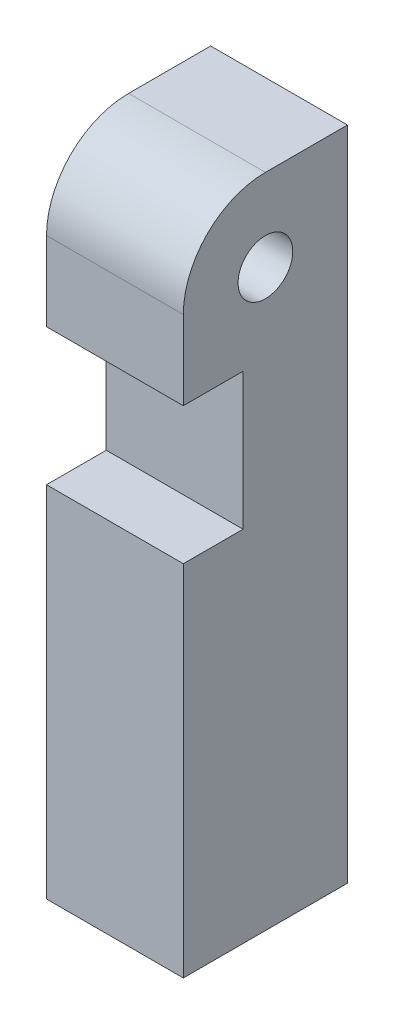
ISO-10303-21;
HEADER;
FILE_DESCRIPTION(('STEP AP214'),'2;1');
FILE_NAME('part.step','',(''),(''),'','','');
FILE_SCHEMA(('AUTOMOTIVE_DESIGN { 1 0 10303 214 1 1 1 1 }'));
ENDSEC;
DATA;
#1=APPLICATION_CONTEXT('core data for automotive mechanical design processes');
#2=APPLICATION_PROTOCOL_DEFINITION('international standard','automotive_design',2000,#1);
#3=PRODUCT_CONTEXT('',#1,'mechanical');
#4=PRODUCT('Part','Part','',(#3));
#5=PRODUCT_RELATED_PRODUCT_CATEGORY('part','',(#4));
#6=PRODUCT_DEFINITION_FORMATION('','',#4);
#7=PRODUCT_DEFINITION_CONTEXT('part definition',#1,'design');
#8=PRODUCT_DEFINITION('design','',#6,#7);
#9=PRODUCT_DEFINITION_SHAPE('','',#8);
#10=(LENGTH_UNIT() NAMED_UNIT(*) SI_UNIT(.MILLI.,.METRE.));
#11=(NAMED_UNIT(*) PLANE_ANGLE_UNIT() SI_UNIT($,.RADIAN.));
#12=(NAMED_UNIT(*) SI_UNIT($,.STERADIAN.) SOLID_ANGLE_UNIT());
#13=UNCERTAINTY_MEASURE_WITH_UNIT(LENGTH_MEASURE(1.E-05),#10,'distance_accuracy_value','');
#14=(GEOMETRIC_REPRESENTATION_CONTEXT(3) GLOBAL_UNCERTAINTY_ASSIGNED_CONTEXT((#13)) GLOBAL_UNIT_ASSIGNED_CONTEXT((#10,
#11,#12)) REPRESENTATION_CONTEXT('',''));
#15=CARTESIAN_POINT('',(0.,0.,0.));
#16=DIRECTION('',(0.,0.,1.));
#17=DIRECTION('',(1.,0.,0.));
#18=AXIS2_PLACEMENT_3D('',#15,#16,#17);
#19=CARTESIAN_POINT('',(6.35,3.81,0.));
#20=DIRECTION('',(0.,-1.,0.));
#21=DIRECTION('',(0.,0.,-1.));
#22=AXIS2_PLACEMENT_3D('',#19,#20,#21);
#23=PLANE('',#22);
#24=DIRECTION('',(0.,0.,1.));
#25=VECTOR('',#24,1.);
#26=CARTESIAN_POINT('',(0.,3.81,0.));
#27=LINE('',#26,#25);
#28=CARTESIAN_POINT('',(0.,3.81,-3.81));
#29=VERTEX_POINT('',#28);
#30=CARTESIAN_POINT('',(0.,3.81,0.));
#31=VERTEX_POINT('',#30);
#32=EDGE_CURVE('E141',#29,#31,#27,.T.);
#33=ORIENTED_EDGE('',*,*,#32,.T.);
#34=DIRECTION('',(-1.,0.,0.));
#35=VECTOR('',#34,1.);
#36=CARTESIAN_POINT('',(6.35,3.81,0.));
#37=LINE('',#36,#35);
#38=CARTESIAN_POINT('',(6.35,3.81,0.));
#39=VERTEX_POINT('',#38);
#40=EDGE_CURVE('E11',#39,#31,#37,.T.);
#41=ORIENTED_EDGE('',*,*,#40,.F.);
#42=DIRECTION('',(0.,0.,1.));
#43=VECTOR('',#42,1.);
#44=CARTESIAN_POINT('',(6.35,3.81,0.));
#45=LINE('',#44,#43);
#46=CARTESIAN_POINT('',(6.35,3.81,-3.81));
#47=VERTEX_POINT('',#46);
#48=EDGE_CURVE('E201',#47,#39,#45,.T.);
#49=ORIENTED_EDGE('',*,*,#48,.F.);
#50=DIRECTION('',(-1.,0.,0.));
#51=VECTOR('',#50,1.);
#52=CARTESIAN_POINT('',(6.35,3.81,-3.81));
#53=LINE('',#52,#51);
#54=EDGE_CURVE('E52',#47,#29,#53,.T.);
#55=ORIENTED_EDGE('',*,*,#54,.T.);
#56=EDGE_LOOP('',(#33,#41,#49,#55));
#57=FACE_BOUND('',#56,.T.);
#58=ADVANCED_FACE('F35',(#57),#23,.F.);
#59=CARTESIAN_POINT('',(6.35,0.,0.));
#60=DIRECTION('',(-1.,0.,0.));
#61=DIRECTION('',(0.,0.,1.));
#62=AXIS2_PLACEMENT_3D('',#59,#60,#61);
#63=CYLINDRICAL_SURFACE('',#62,3.81);
#64=CARTESIAN_POINT('',(0.,0.,0.));
#65=DIRECTION('',(1.,0.,0.));
#66=DIRECTION('',(0.,0.,-1.));
#67=AXIS2_PLACEMENT_3D('',#64,#65,#66);
#68=CIRCLE('',#67,3.81);
#69=CARTESIAN_POINT('',(0.,0.,3.81));
#70=VERTEX_POINT('',#69);
#71=EDGE_CURVE('E143',#31,#70,#68,.T.);
#72=ORIENTED_EDGE('',*,*,#71,.T.);
#73=DIRECTION('',(-1.,0.,0.));
#74=VECTOR('',#73,1.);
#75=CARTESIAN_POINT('',(6.35,0.,3.81));
#76=LINE('',#75,#74);
#77=CARTESIAN_POINT('',(6.35,0.,3.81));
#78=VERTEX_POINT('',#77);
#79=EDGE_CURVE('E44',#78,#70,#76,.T.);
#80=ORIENTED_EDGE('',*,*,#79,.F.);
#81=CARTESIAN_POINT('',(6.35,0.,0.));
#82=DIRECTION('',(1.,0.,0.));
#83=DIRECTION('',(0.,0.,-1.));
#84=AXIS2_PLACEMENT_3D('',#81,#82,#83);
#85=CIRCLE('',#84,3.81);
#86=EDGE_CURVE('E93',#39,#78,#85,.T.);
#87=ORIENTED_EDGE('',*,*,#86,.F.);
#88=ORIENTED_EDGE('',*,*,#40,.T.);
#89=EDGE_LOOP('',(#72,#80,#87,#88));
#90=FACE_BOUND('',#89,.T.);
#91=ADVANCED_FACE('F179',(#90),#63,.T.);
#92=CARTESIAN_POINT('',(6.35,0.,3.81));
#93=DIRECTION('',(0.,0.,1.));
#94=DIRECTION('',(0.,-1.,0.));
#95=AXIS2_PLACEMENT_3D('',#92,#93,#94);
#96=PLANE('',#95);
#97=DIRECTION('',(0.,1.,0.));
#98=VECTOR('',#97,1.);
#99=CARTESIAN_POINT('',(0.,0.,3.81));
#100=LINE('',#99,#98);
#101=CARTESIAN_POINT('',(0.,-3.66601879962787,3.81));
#102=VERTEX_POINT('',#101);
#103=EDGE_CURVE('E146',#102,#70,#100,.T.);
#104=ORIENTED_EDGE('',*,*,#103,.F.);
#105=DIRECTION('',(-1.,0.,0.));
#106=VECTOR('',#105,1.);
#107=CARTESIAN_POINT('',(6.35,-3.66601879962787,3.81));
#108=LINE('',#107,#106);
#109=CARTESIAN_POINT('',(6.35,-3.66601879962787,3.81));
#110=VERTEX_POINT('',#109);
#111=EDGE_CURVE('E172',#110,#102,#108,.T.);
#112=ORIENTED_EDGE('',*,*,#111,.F.);
#113=DIRECTION('',(0.,1.,0.));
#114=VECTOR('',#113,1.);
#115=CARTESIAN_POINT('',(6.35,0.,3.81));
#116=LINE('',#115,#114);
#117=EDGE_CURVE('E178',#110,#78,#116,.T.);
#118=ORIENTED_EDGE('',*,*,#117,.T.);
#119=ORIENTED_EDGE('',*,*,#79,.T.);
#120=EDGE_LOOP('',(#104,#112,#118,#119));
#121=FACE_BOUND('',#120,.T.);
#122=ADVANCED_FACE('F176',(#121),#96,.T.);
#123=CARTESIAN_POINT('',(6.35,-3.66601879962787,0.));
#124=DIRECTION('',(0.,1.,0.));
#125=DIRECTION('',(0.,0.,1.));
#126=AXIS2_PLACEMENT_3D('',#123,#124,#125);
#127=PLANE('',#126);
#128=DIRECTION('',(0.,0.,-1.));
#129=VECTOR('',#128,1.);
#130=CARTESIAN_POINT('',(0.,-3.66601879962787,0.));
#131=LINE('',#130,#129);
#132=CARTESIAN_POINT('',(0.,-3.66601879962787,1.037499957));
#133=VERTEX_POINT('',#132);
#134=EDGE_CURVE('E149',#102,#133,#131,.T.);
#135=ORIENTED_EDGE('',*,*,#134,.T.);
#136=DIRECTION('',(-1.,0.,0.));
#137=VECTOR('',#136,1.);
#138=CARTESIAN_POINT('',(6.35,-3.66601879962787,1.037499957));
#139=LINE('',#138,#137);
#140=CARTESIAN_POINT('',(6.35,-3.66601879962787,1.037499957));
#141=VERTEX_POINT('',#140);
#142=EDGE_CURVE('E169',#141,#133,#139,.T.);
#143=ORIENTED_EDGE('',*,*,#142,.F.);
#144=DIRECTION('',(0.,0.,-1.));
#145=VECTOR('',#144,1.);
#146=CARTESIAN_POINT('',(6.35,-3.66601879962787,0.));
#147=LINE('',#146,#145);
#148=EDGE_CURVE('E195',#110,#141,#147,.T.);
#149=ORIENTED_EDGE('',*,*,#148,.F.);
#150=ORIENTED_EDGE('',*,*,#111,.T.);
#151=EDGE_LOOP('',(#135,#143,#149,#150));
#152=FACE_BOUND('',#151,.T.);
#153=ADVANCED_FACE('F188',(#152),#127,.F.);
#154=CARTESIAN_POINT('',(6.35,0.,1.037499957));
#155=DIRECTION('',(0.,0.,-1.));
#156=DIRECTION('',(-1.,0.,0.));
#157=AXIS2_PLACEMENT_3D('',#154,#155,#156);
#158=PLANE('',#157);
#159=DIRECTION('',(0.,-1.,0.));
#160=VECTOR('',#159,1.);
#161=CARTESIAN_POINT('',(0.,0.,1.037499957));
#162=LINE('',#161,#160);
#163=CARTESIAN_POINT('',(0.,-10.0160187996279,1.037499957));
#164=VERTEX_POINT('',#163);
#165=EDGE_CURVE('E151',#133,#164,#162,.T.);
#166=ORIENTED_EDGE('',*,*,#165,.T.);
#167=DIRECTION('',(-1.,0.,0.));
#168=VECTOR('',#167,1.);
#169=CARTESIAN_POINT('',(6.35,-10.0160187996279,1.037499957));
#170=LINE('',#169,#168);
#171=CARTESIAN_POINT('',(6.35,-10.0160187996279,1.037499957));
#172=VERTEX_POINT('',#171);
#173=EDGE_CURVE('E166',#172,#164,#170,.T.);
#174=ORIENTED_EDGE('',*,*,#173,.F.);
#175=DIRECTION('',(0.,-1.,0.));
#176=VECTOR('',#175,1.);
#177=CARTESIAN_POINT('',(6.35,0.,1.037499957));
#178=LINE('',#177,#176);
#179=EDGE_CURVE('E194',#141,#172,#178,.T.);
#180=ORIENTED_EDGE('',*,*,#179,.F.);
#181=ORIENTED_EDGE('',*,*,#142,.T.);
#182=EDGE_LOOP('',(#166,#174,#180,#181));
#183=FACE_BOUND('',#182,.T.);
#184=ADVANCED_FACE('F192',(#183),#158,.F.);
#185=CARTESIAN_POINT('',(6.35,-10.0160187996279,0.));
#186=DIRECTION('',(0.,-1.,0.));
#187=DIRECTION('',(0.,0.,-1.));
#188=AXIS2_PLACEMENT_3D('',#185,#186,#187);
#189=PLANE('',#188);
#190=DIRECTION('',(0.,0.,1.));
#191=VECTOR('',#190,1.);
#192=CARTESIAN_POINT('',(0.,-10.0160187996279,0.));
#193=LINE('',#192,#191);
#194=CARTESIAN_POINT('',(0.,-10.0160187996279,3.81));
#195=VERTEX_POINT('',#194);
#196=EDGE_CURVE('E153',#164,#195,#193,.T.);
#197=ORIENTED_EDGE('',*,*,#196,.T.);
#198=DIRECTION('',(-1.,0.,0.));
#199=VECTOR('',#198,1.);
#200=CARTESIAN_POINT('',(6.35,-10.0160187996279,3.81));
#201=LINE('',#200,#199);
#202=CARTESIAN_POINT('',(6.35,-10.0160187996279,3.81));
#203=VERTEX_POINT('',#202);
#204=EDGE_CURVE('E121',#203,#195,#201,.T.);
#205=ORIENTED_EDGE('',*,*,#204,.F.);
#206=DIRECTION('',(0.,0.,1.));
#207=VECTOR('',#206,1.);
#208=CARTESIAN_POINT('',(6.35,-10.0160187996279,0.));
#209=LINE('',#208,#207);
#210=EDGE_CURVE('E129',#172,#203,#209,.T.);
#211=ORIENTED_EDGE('',*,*,#210,.F.);
#212=ORIENTED_EDGE('',*,*,#173,.T.);
#213=EDGE_LOOP('',(#197,#205,#211,#212));
#214=FACE_BOUND('',#213,.T.);
#215=ADVANCED_FACE('F230',(#214),#189,.F.);
#216=CARTESIAN_POINT('',(6.35,0.,3.81));
#217=DIRECTION('',(0.,0.,1.));
#218=DIRECTION('',(1.,0.,0.));
#219=AXIS2_PLACEMENT_3D('',#216,#217,#218);
#220=PLANE('',#219);
#221=DIRECTION('',(0.,1.,0.));
#222=VECTOR('',#221,1.);
#223=CARTESIAN_POINT('',(0.,0.,3.81));
#224=LINE('',#223,#222);
#225=CARTESIAN_POINT('',(0.,-26.67,3.81));
#226=VERTEX_POINT('',#225);
#227=EDGE_CURVE('E117',#226,#195,#224,.T.);
#228=ORIENTED_EDGE('',*,*,#227,.F.);
#229=DIRECTION('',(-1.,0.,0.));
#230=VECTOR('',#229,1.);
#231=CARTESIAN_POINT('',(6.35,-26.67,3.81));
#232=LINE('',#231,#230);
#233=CARTESIAN_POINT('',(6.35,-26.67,3.81));
#234=VERTEX_POINT('',#233);
#235=EDGE_CURVE('E112',#234,#226,#232,.T.);
#236=ORIENTED_EDGE('',*,*,#235,.F.);
#237=DIRECTION('',(0.,1.,0.));
#238=VECTOR('',#237,1.);
#239=CARTESIAN_POINT('',(6.35,0.,3.81));
#240=LINE('',#239,#238);
#241=EDGE_CURVE('E115',#234,#203,#240,.T.);
#242=ORIENTED_EDGE('',*,*,#241,.T.);
#243=ORIENTED_EDGE('',*,*,#204,.T.);
#244=EDGE_LOOP('',(#228,#236,#242,#243));
#245=FACE_BOUND('',#244,.T.);
#246=ADVANCED_FACE('F114',(#245),#220,.T.);
#247=CARTESIAN_POINT('',(6.35,-26.67,0.));
#248=DIRECTION('',(0.,-1.,0.));
#249=DIRECTION('',(0.,0.,-1.));
#250=AXIS2_PLACEMENT_3D('',#247,#248,#249);
#251=PLANE('',#250);
#252=DIRECTION('',(0.,0.,1.));
#253=VECTOR('',#252,1.);
#254=CARTESIAN_POINT('',(0.,-26.67,0.));
#255=LINE('',#254,#253);
#256=CARTESIAN_POINT('',(0.,-26.67,-3.81));
#257=VERTEX_POINT('',#256);
#258=EDGE_CURVE('E157',#257,#226,#255,.T.);
#259=ORIENTED_EDGE('',*,*,#258,.F.);
#260=DIRECTION('',(-1.,0.,0.));
#261=VECTOR('',#260,1.);
#262=CARTESIAN_POINT('',(6.35,-26.67,-3.81));
#263=LINE('',#262,#261);
#264=CARTESIAN_POINT('',(6.35,-26.67,-3.81));
#265=VERTEX_POINT('',#264);
#266=EDGE_CURVE('E81',#265,#257,#263,.T.);
#267=ORIENTED_EDGE('',*,*,#266,.F.);
#268=DIRECTION('',(0.,0.,1.));
#269=VECTOR('',#268,1.);
#270=CARTESIAN_POINT('',(6.35,-26.67,0.));
#271=LINE('',#270,#269);
#272=EDGE_CURVE('E127',#265,#234,#271,.T.);
#273=ORIENTED_EDGE('',*,*,#272,.T.);
#274=ORIENTED_EDGE('',*,*,#235,.T.);
#275=EDGE_LOOP('',(#259,#267,#273,#274));
#276=FACE_BOUND('',#275,.T.);
#277=ADVANCED_FACE('F132',(#276),#251,.T.);
#278=CARTESIAN_POINT('',(6.35,0.,0.));
#279=DIRECTION('',(-1.,0.,0.));
#280=DIRECTION('',(0.,0.,1.));
#281=AXIS2_PLACEMENT_3D('',#278,#279,#280);
#282=CYLINDRICAL_SURFACE('',#281,1.27);
#283=CARTESIAN_POINT('',(6.35,0.,0.));
#284=DIRECTION('',(1.,0.,0.));
#285=DIRECTION('',(0.,0.,-1.));
#286=AXIS2_PLACEMENT_3D('',#283,#284,#285);
#287=CIRCLE('',#286,1.27);
#288=CARTESIAN_POINT('',(6.35,0.,-1.27));
#289=VERTEX_POINT('',#288);
#290=EDGE_CURVE('E162',#289,#289,#287,.T.);
#291=ORIENTED_EDGE('',*,*,#290,.T.);
#292=EDGE_LOOP('',(#291));
#293=FACE_BOUND('',#292,.T.);
#294=CARTESIAN_POINT('',(0.,0.,0.));
#295=DIRECTION('',(1.,0.,0.));
#296=DIRECTION('',(0.,0.,-1.));
#297=AXIS2_PLACEMENT_3D('',#294,#295,#296);
#298=CIRCLE('',#297,1.27);
#299=CARTESIAN_POINT('',(0.,0.,-1.27));
#300=VERTEX_POINT('',#299);
#301=EDGE_CURVE('E138',#300,#300,#298,.T.);
#302=ORIENTED_EDGE('',*,*,#301,.F.);
#303=EDGE_LOOP('',(#302));
#304=FACE_BOUND('',#303,.T.);
#305=ADVANCED_FACE('F37',(#293,#304),#282,.F.);
#306=CARTESIAN_POINT('',(6.35,0.,-3.81));
#307=DIRECTION('',(0.,0.,-1.));
#308=DIRECTION('',(0.,1.,0.));
#309=AXIS2_PLACEMENT_3D('',#306,#307,#308);
#310=PLANE('',#309);
#311=DIRECTION('',(0.,-1.,0.));
#312=VECTOR('',#311,1.);
#313=CARTESIAN_POINT('',(0.,0.,-3.81));
#314=LINE('',#313,#312);
#315=EDGE_CURVE('E159',#29,#257,#314,.T.);
#316=ORIENTED_EDGE('',*,*,#315,.F.);
#317=ORIENTED_EDGE('',*,*,#54,.F.);
#318=DIRECTION('',(0.,-1.,0.));
#319=VECTOR('',#318,1.);
#320=CARTESIAN_POINT('',(6.35,0.,-3.81));
#321=LINE('',#320,#319);
#322=EDGE_CURVE('E133',#47,#265,#321,.T.);
#323=ORIENTED_EDGE('',*,*,#322,.T.);
#324=ORIENTED_EDGE('',*,*,#266,.T.);
#325=EDGE_LOOP('',(#316,#317,#323,#324));
#326=FACE_BOUND('',#325,.T.);
#327=ADVANCED_FACE('F209',(#326),#310,.T.);
#328=CARTESIAN_POINT('',(6.35,0.,0.));
#329=DIRECTION('',(1.,0.,0.));
#330=DIRECTION('',(0.,0.,-1.));
#331=AXIS2_PLACEMENT_3D('',#328,#329,#330);
#332=PLANE('',#331);
#333=ORIENTED_EDGE('',*,*,#290,.F.);
#334=EDGE_LOOP('',(#333));
#335=FACE_BOUND('',#334,.T.);
#336=ORIENTED_EDGE('',*,*,#48,.T.);
#337=ORIENTED_EDGE('',*,*,#86,.T.);
#338=ORIENTED_EDGE('',*,*,#117,.F.);
#339=ORIENTED_EDGE('',*,*,#148,.T.);
#340=ORIENTED_EDGE('',*,*,#179,.T.);
#341=ORIENTED_EDGE('',*,*,#210,.T.);
#342=ORIENTED_EDGE('',*,*,#241,.F.);
#343=ORIENTED_EDGE('',*,*,#272,.F.);
#344=ORIENTED_EDGE('',*,*,#322,.F.);
#345=EDGE_LOOP('',(#336,#337,#338,#339,#340,#341,#342,#343,#344));
#346=FACE_BOUND('',#345,.T.);
#347=ADVANCED_FACE('F125',(#335,#346),#332,.T.);
#348=CARTESIAN_POINT('',(0.,0.,0.));
#349=DIRECTION('',(1.,0.,0.));
#350=DIRECTION('',(0.,0.,-1.));
#351=AXIS2_PLACEMENT_3D('',#348,#349,#350);
#352=PLANE('',#351);
#353=ORIENTED_EDGE('',*,*,#301,.T.);
#354=EDGE_LOOP('',(#353));
#355=FACE_BOUND('',#354,.T.);
#356=ORIENTED_EDGE('',*,*,#32,.F.);
#357=ORIENTED_EDGE('',*,*,#315,.T.);
#358=ORIENTED_EDGE('',*,*,#258,.T.);
#359=ORIENTED_EDGE('',*,*,#227,.T.);
#360=ORIENTED_EDGE('',*,*,#196,.F.);
#361=ORIENTED_EDGE('',*,*,#165,.F.);
#362=ORIENTED_EDGE('',*,*,#134,.F.);
#363=ORIENTED_EDGE('',*,*,#103,.T.);
#364=ORIENTED_EDGE('',*,*,#71,.F.);
#365=EDGE_LOOP('',(#356,#357,#358,#359,#360,#361,#362,#363,#364));
#366=FACE_BOUND('',#365,.T.);
#367=ADVANCED_FACE('F183',(#355,#366),#352,.F.);
#368=CLOSED_SHELL('',(#58,#91,#122,#153,#184,#215,#246,#277,#305,#327,#347,#367));
#369=MANIFOLD_SOLID_BREP('B2',#368);
#370=ADVANCED_BREP_SHAPE_REPRESENTATION('',(#18,#369),#14);
#371=SHAPE_DEFINITION_REPRESENTATION(#9,#370);
ENDSEC;
END-ISO-10303-21;
